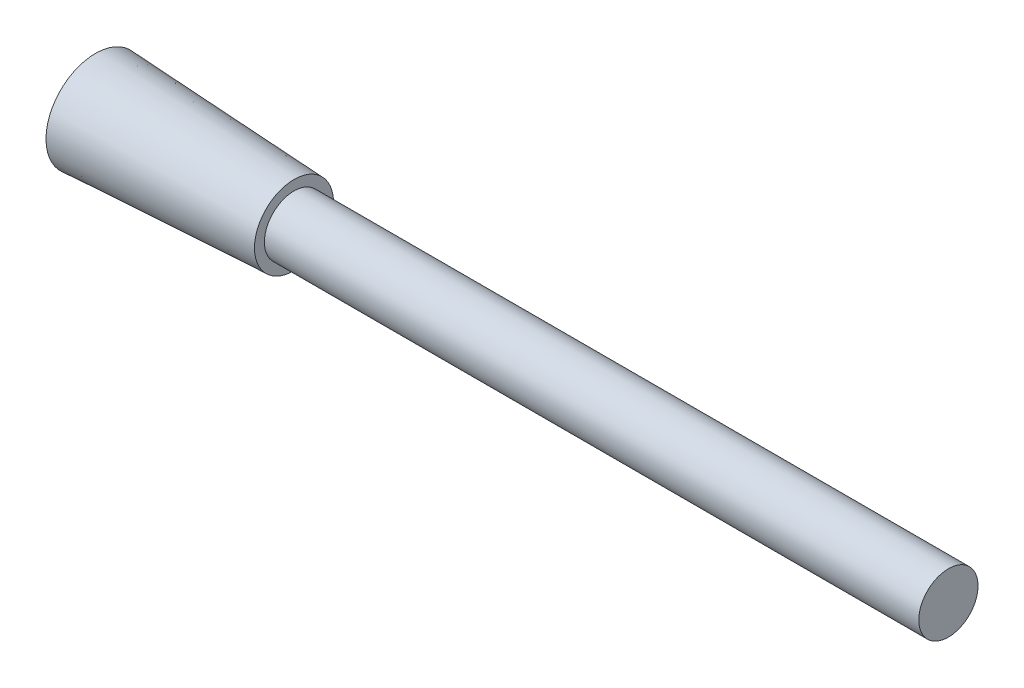
ISO-10303-21;
HEADER;
FILE_DESCRIPTION(('STEP AP214'),'2;1');
FILE_NAME('part.step','',(''),(''),'','','');
FILE_SCHEMA(('AUTOMOTIVE_DESIGN { 1 0 10303 214 1 1 1 1 }'));
ENDSEC;
DATA;
#1=APPLICATION_CONTEXT('core data for automotive mechanical design processes');
#2=APPLICATION_PROTOCOL_DEFINITION('international standard','automotive_design',2000,#1);
#3=PRODUCT_CONTEXT('',#1,'mechanical');
#4=PRODUCT('Part','Part','',(#3));
#5=PRODUCT_RELATED_PRODUCT_CATEGORY('part','',(#4));
#6=PRODUCT_DEFINITION_FORMATION('','',#4);
#7=PRODUCT_DEFINITION_CONTEXT('part definition',#1,'design');
#8=PRODUCT_DEFINITION('design','',#6,#7);
#9=PRODUCT_DEFINITION_SHAPE('','',#8);
#10=(LENGTH_UNIT() NAMED_UNIT(*) SI_UNIT(.MILLI.,.METRE.));
#11=(NAMED_UNIT(*) PLANE_ANGLE_UNIT() SI_UNIT($,.RADIAN.));
#12=(NAMED_UNIT(*) SI_UNIT($,.STERADIAN.) SOLID_ANGLE_UNIT());
#13=UNCERTAINTY_MEASURE_WITH_UNIT(LENGTH_MEASURE(1.E-05),#10,'distance_accuracy_value','');
#14=(GEOMETRIC_REPRESENTATION_CONTEXT(3) GLOBAL_UNCERTAINTY_ASSIGNED_CONTEXT((#13)) GLOBAL_UNIT_ASSIGNED_CONTEXT((#10,
#11,#12)) REPRESENTATION_CONTEXT('',''));
#15=CARTESIAN_POINT('',(0.,0.,0.));
#16=DIRECTION('',(0.,0.,1.));
#17=DIRECTION('',(1.,0.,0.));
#18=AXIS2_PLACEMENT_3D('',#15,#16,#17);
#19=CARTESIAN_POINT('',(654.474617049108,0.,894.5));
#20=DIRECTION('',(1.,0.,0.));
#21=DIRECTION('',(0.,0.,-1.));
#22=AXIS2_PLACEMENT_3D('',#19,#20,#21);
#23=PLANE('',#22);
#24=CARTESIAN_POINT('',(654.474617049108,0.,890.));
#25=DIRECTION('',(-1.,0.,0.));
#26=DIRECTION('',(0.,0.,1.));
#27=AXIS2_PLACEMENT_3D('',#24,#25,#26);
#28=CIRCLE('',#27,4.49999999999995);
#29=CARTESIAN_POINT('',(654.474617049108,0.,894.5));
#30=VERTEX_POINT('',#29);
#31=EDGE_CURVE('E59',#30,#30,#28,.T.);
#32=ORIENTED_EDGE('',*,*,#31,.F.);
#33=EDGE_LOOP('',(#32));
#34=FACE_BOUND('',#33,.T.);
#35=ADVANCED_FACE('F41',(#34),#23,.T.);
#36=CARTESIAN_POINT('',(525.,0.,890.));
#37=DIRECTION('',(-1.,0.,0.));
#38=DIRECTION('',(0.,0.,1.));
#39=AXIS2_PLACEMENT_3D('',#36,#37,#38);
#40=PLANE('',#39);
#41=CARTESIAN_POINT('',(525.,0.,890.));
#42=DIRECTION('',(-1.,0.,0.));
#43=DIRECTION('',(0.,0.,1.));
#44=AXIS2_PLACEMENT_3D('',#41,#42,#43);
#45=CIRCLE('',#44,7.49999999999995);
#46=CARTESIAN_POINT('',(525.,0.,897.5));
#47=VERTEX_POINT('',#46);
#48=EDGE_CURVE('E10',#47,#47,#45,.T.);
#49=ORIENTED_EDGE('',*,*,#48,.T.);
#50=EDGE_LOOP('',(#49));
#51=FACE_BOUND('',#50,.T.);
#52=ADVANCED_FACE('F69',(#51),#40,.T.);
#53=CARTESIAN_POINT('',(525.,0.,890.));
#54=DIRECTION('',(-1.,0.,0.));
#55=DIRECTION('',(0.,0.,1.));
#56=AXIS2_PLACEMENT_3D('',#53,#54,#55);
#57=CONICAL_SURFACE('',#56,7.49999999999995,0.0497192800846945);
#58=CARTESIAN_POINT('',(555.144519194544,0.,890.));
#59=DIRECTION('',(-1.,0.,0.));
#60=DIRECTION('',(0.,0.,1.));
#61=AXIS2_PLACEMENT_3D('',#58,#59,#60);
#62=CIRCLE('',#61,6.00000000000001);
#63=CARTESIAN_POINT('',(555.144519194544,0.,896.));
#64=VERTEX_POINT('',#63);
#65=EDGE_CURVE('E48',#64,#64,#62,.T.);
#66=ORIENTED_EDGE('',*,*,#65,.T.);
#67=EDGE_LOOP('',(#66));
#68=FACE_BOUND('',#67,.T.);
#69=ORIENTED_EDGE('',*,*,#48,.F.);
#70=EDGE_LOOP('',(#69));
#71=FACE_BOUND('',#70,.T.);
#72=ADVANCED_FACE('F73',(#68,#71),#57,.T.);
#73=CARTESIAN_POINT('',(555.144519194544,0.,896.));
#74=DIRECTION('',(1.,0.,0.));
#75=DIRECTION('',(0.,0.,-1.));
#76=AXIS2_PLACEMENT_3D('',#73,#74,#75);
#77=PLANE('',#76);
#78=CARTESIAN_POINT('',(555.144519194544,0.,890.));
#79=DIRECTION('',(-1.,0.,0.));
#80=DIRECTION('',(0.,0.,1.));
#81=AXIS2_PLACEMENT_3D('',#78,#79,#80);
#82=CIRCLE('',#81,4.49999999999995);
#83=CARTESIAN_POINT('',(555.144519194544,0.,894.5));
#84=VERTEX_POINT('',#83);
#85=EDGE_CURVE('E55',#84,#84,#82,.T.);
#86=ORIENTED_EDGE('',*,*,#85,.T.);
#87=EDGE_LOOP('',(#86));
#88=FACE_BOUND('',#87,.T.);
#89=ORIENTED_EDGE('',*,*,#65,.F.);
#90=EDGE_LOOP('',(#89));
#91=FACE_BOUND('',#90,.T.);
#92=ADVANCED_FACE('F77',(#88,#91),#77,.T.);
#93=CARTESIAN_POINT('',(525.,0.,890.));
#94=DIRECTION('',(-1.,0.,0.));
#95=DIRECTION('',(0.,0.,1.));
#96=AXIS2_PLACEMENT_3D('',#93,#94,#95);
#97=CYLINDRICAL_SURFACE('',#96,4.49999999999995);
#98=ORIENTED_EDGE('',*,*,#31,.T.);
#99=EDGE_LOOP('',(#98));
#100=FACE_BOUND('',#99,.T.);
#101=ORIENTED_EDGE('',*,*,#85,.F.);
#102=EDGE_LOOP('',(#101));
#103=FACE_BOUND('',#102,.T.);
#104=ADVANCED_FACE('F65',(#100,#103),#97,.T.);
#105=CLOSED_SHELL('',(#35,#52,#72,#92,#104));
#106=MANIFOLD_SOLID_BREP('B2',#105);
#107=ADVANCED_BREP_SHAPE_REPRESENTATION('',(#18,#106),#14);
#108=SHAPE_DEFINITION_REPRESENTATION(#9,#107);
ENDSEC;
END-ISO-10303-21;
